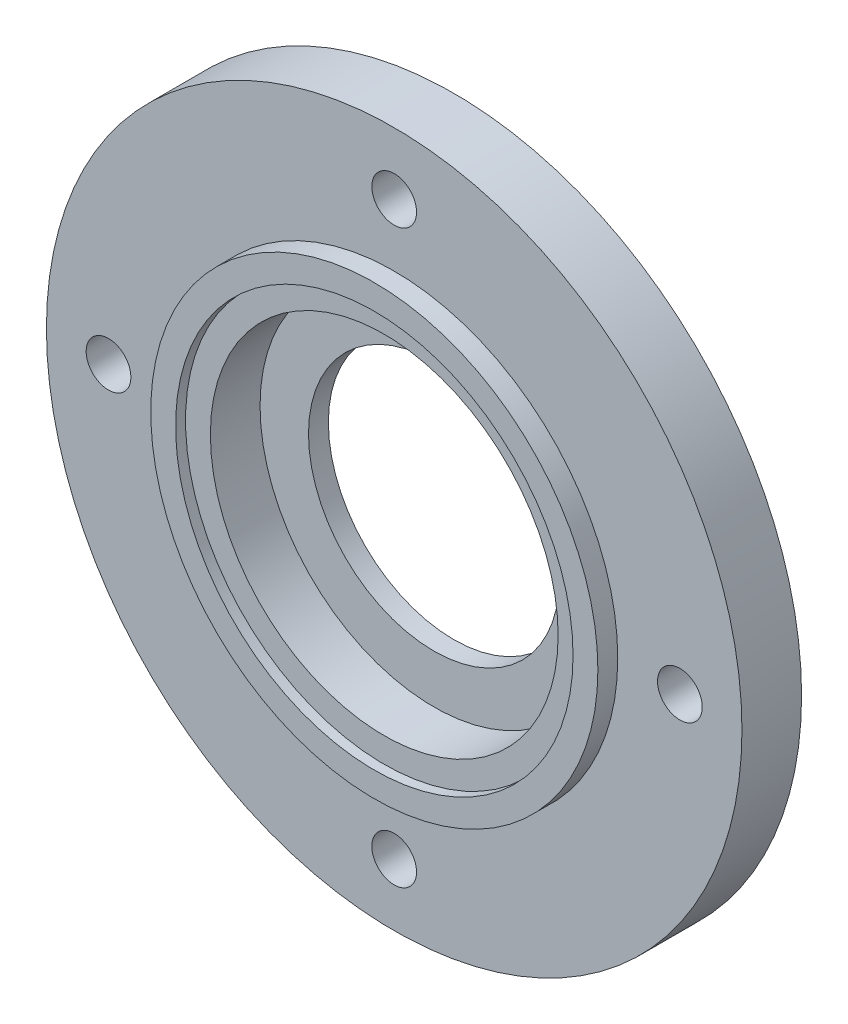
ISO-10303-21;
HEADER;
FILE_DESCRIPTION(('STEP AP214'),'2;1');
FILE_NAME('part.step','',(''),(''),'','','');
FILE_SCHEMA(('AUTOMOTIVE_DESIGN { 1 0 10303 214 1 1 1 1 }'));
ENDSEC;
DATA;
#1=APPLICATION_CONTEXT('core data for automotive mechanical design processes');
#2=APPLICATION_PROTOCOL_DEFINITION('international standard','automotive_design',2000,#1);
#3=PRODUCT_CONTEXT('',#1,'mechanical');
#4=PRODUCT('Part','Part','',(#3));
#5=PRODUCT_RELATED_PRODUCT_CATEGORY('part','',(#4));
#6=PRODUCT_DEFINITION_FORMATION('','',#4);
#7=PRODUCT_DEFINITION_CONTEXT('part definition',#1,'design');
#8=PRODUCT_DEFINITION('design','',#6,#7);
#9=PRODUCT_DEFINITION_SHAPE('','',#8);
#10=(LENGTH_UNIT() NAMED_UNIT(*) SI_UNIT(.MILLI.,.METRE.));
#11=(NAMED_UNIT(*) PLANE_ANGLE_UNIT() SI_UNIT($,.RADIAN.));
#12=(NAMED_UNIT(*) SI_UNIT($,.STERADIAN.) SOLID_ANGLE_UNIT());
#13=UNCERTAINTY_MEASURE_WITH_UNIT(LENGTH_MEASURE(1.E-05),#10,'distance_accuracy_value','');
#14=(GEOMETRIC_REPRESENTATION_CONTEXT(3) GLOBAL_UNCERTAINTY_ASSIGNED_CONTEXT((#13)) GLOBAL_UNIT_ASSIGNED_CONTEXT((#10,
#11,#12)) REPRESENTATION_CONTEXT('',''));
#15=CARTESIAN_POINT('',(0.,0.,0.));
#16=DIRECTION('',(0.,0.,1.));
#17=DIRECTION('',(1.,0.,0.));
#18=AXIS2_PLACEMENT_3D('',#15,#16,#17);
#19=CARTESIAN_POINT('',(0.,0.,-10.));
#20=DIRECTION('',(0.,0.,1.));
#21=DIRECTION('',(1.,0.,0.));
#22=AXIS2_PLACEMENT_3D('',#19,#20,#21);
#23=CYLINDRICAL_SURFACE('',#22,25.25);
#24=CARTESIAN_POINT('',(0.,0.,0.));
#25=DIRECTION('',(0.,0.,1.));
#26=DIRECTION('',(1.,0.,0.));
#27=AXIS2_PLACEMENT_3D('',#24,#25,#26);
#28=CIRCLE('',#27,25.25);
#29=CARTESIAN_POINT('',(25.25,0.,0.));
#30=VERTEX_POINT('',#29);
#31=EDGE_CURVE('E61',#30,#30,#28,.T.);
#32=ORIENTED_EDGE('',*,*,#31,.F.);
#33=EDGE_LOOP('',(#32));
#34=FACE_BOUND('',#33,.T.);
#35=CARTESIAN_POINT('',(0.,0.,4.));
#36=DIRECTION('',(0.,0.,1.));
#37=DIRECTION('',(1.,0.,0.));
#38=AXIS2_PLACEMENT_3D('',#35,#36,#37);
#39=CIRCLE('',#38,25.25);
#40=CARTESIAN_POINT('',(25.25,0.,4.));
#41=VERTEX_POINT('',#40);
#42=EDGE_CURVE('E41',#41,#41,#39,.F.);
#43=ORIENTED_EDGE('',*,*,#42,.F.);
#44=EDGE_LOOP('',(#43));
#45=FACE_BOUND('',#44,.T.);
#46=ADVANCED_FACE('F37',(#34,#45),#23,.F.);
#47=CARTESIAN_POINT('',(0.,0.,16.));
#48=DIRECTION('',(0.,0.,-1.));
#49=DIRECTION('',(-1.,0.,0.));
#50=AXIS2_PLACEMENT_3D('',#47,#48,#49);
#51=CYLINDRICAL_SURFACE('',#50,70.);
#52=CARTESIAN_POINT('',(0.,0.,0.));
#53=DIRECTION('',(0.,0.,1.));
#54=DIRECTION('',(1.,0.,0.));
#55=AXIS2_PLACEMENT_3D('',#52,#53,#54);
#56=CIRCLE('',#55,70.);
#57=CARTESIAN_POINT('',(70.,0.,0.));
#58=VERTEX_POINT('',#57);
#59=EDGE_CURVE('E10',#58,#58,#56,.T.);
#60=ORIENTED_EDGE('',*,*,#59,.T.);
#61=EDGE_LOOP('',(#60));
#62=FACE_BOUND('',#61,.T.);
#63=CARTESIAN_POINT('',(0.,0.,12.));
#64=DIRECTION('',(0.,0.,1.));
#65=DIRECTION('',(1.,0.,0.));
#66=AXIS2_PLACEMENT_3D('',#63,#64,#65);
#67=CIRCLE('',#66,70.);
#68=CARTESIAN_POINT('',(70.,0.,12.));
#69=VERTEX_POINT('',#68);
#70=EDGE_CURVE('E60',#69,#69,#67,.T.);
#71=ORIENTED_EDGE('',*,*,#70,.F.);
#72=EDGE_LOOP('',(#71));
#73=FACE_BOUND('',#72,.T.);
#74=ADVANCED_FACE('F39',(#62,#73),#51,.T.);
#75=CARTESIAN_POINT('',(0.,57.5,16.));
#76=DIRECTION('',(0.,0.,-1.));
#77=DIRECTION('',(-1.,0.,0.));
#78=AXIS2_PLACEMENT_3D('',#75,#76,#77);
#79=CYLINDRICAL_SURFACE('',#78,4.5);
#80=CARTESIAN_POINT('',(0.,57.5,0.));
#81=DIRECTION('',(0.,0.,1.));
#82=DIRECTION('',(1.,0.,0.));
#83=AXIS2_PLACEMENT_3D('',#80,#81,#82);
#84=CIRCLE('',#83,4.5);
#85=CARTESIAN_POINT('',(4.5,57.5,0.));
#86=VERTEX_POINT('',#85);
#87=EDGE_CURVE('E46',#86,#86,#84,.T.);
#88=ORIENTED_EDGE('',*,*,#87,.F.);
#89=EDGE_LOOP('',(#88));
#90=FACE_BOUND('',#89,.T.);
#91=CARTESIAN_POINT('',(0.,57.5,12.));
#92=DIRECTION('',(0.,0.,1.));
#93=DIRECTION('',(1.,0.,0.));
#94=AXIS2_PLACEMENT_3D('',#91,#92,#93);
#95=CIRCLE('',#94,4.5);
#96=CARTESIAN_POINT('',(4.5,57.5,12.));
#97=VERTEX_POINT('',#96);
#98=EDGE_CURVE('E107',#97,#97,#95,.T.);
#99=ORIENTED_EDGE('',*,*,#98,.T.);
#100=EDGE_LOOP('',(#99));
#101=FACE_BOUND('',#100,.T.);
#102=ADVANCED_FACE('F129',(#90,#101),#79,.F.);
#103=CARTESIAN_POINT('',(57.5000000000016,1.62368571360558E-12,16.));
#104=DIRECTION('',(0.,0.,-1.));
#105=DIRECTION('',(-1.,0.,0.));
#106=AXIS2_PLACEMENT_3D('',#103,#104,#105);
#107=CYLINDRICAL_SURFACE('',#106,4.50000000000127);
#108=CARTESIAN_POINT('',(57.5000000000016,1.62368571360558E-12,0.));
#109=DIRECTION('',(0.,0.,1.));
#110=DIRECTION('',(1.,0.,0.));
#111=AXIS2_PLACEMENT_3D('',#108,#109,#110);
#112=CIRCLE('',#111,4.50000000000127);
#113=CARTESIAN_POINT('',(62.0000000000029,1.62368571360558E-12,0.));
#114=VERTEX_POINT('',#113);
#115=EDGE_CURVE('E52',#114,#114,#112,.T.);
#116=ORIENTED_EDGE('',*,*,#115,.F.);
#117=EDGE_LOOP('',(#116));
#118=FACE_BOUND('',#117,.T.);
#119=CARTESIAN_POINT('',(57.5000000000016,1.62368571360558E-12,12.));
#120=DIRECTION('',(0.,0.,1.));
#121=DIRECTION('',(1.,0.,0.));
#122=AXIS2_PLACEMENT_3D('',#119,#120,#121);
#123=CIRCLE('',#122,4.50000000000127);
#124=CARTESIAN_POINT('',(62.0000000000029,1.62368571360558E-12,12.));
#125=VERTEX_POINT('',#124);
#126=EDGE_CURVE('E103',#125,#125,#123,.T.);
#127=ORIENTED_EDGE('',*,*,#126,.T.);
#128=EDGE_LOOP('',(#127));
#129=FACE_BOUND('',#128,.T.);
#130=ADVANCED_FACE('F125',(#118,#129),#107,.F.);
#131=CARTESIAN_POINT('',(3.24737142721117E-12,-57.5,16.));
#132=DIRECTION('',(0.,0.,-1.));
#133=DIRECTION('',(-1.,0.,0.));
#134=AXIS2_PLACEMENT_3D('',#131,#132,#133);
#135=CYLINDRICAL_SURFACE('',#134,4.50000000000349);
#136=CARTESIAN_POINT('',(3.24737142721117E-12,-57.5,0.));
#137=DIRECTION('',(0.,0.,1.));
#138=DIRECTION('',(1.,0.,0.));
#139=AXIS2_PLACEMENT_3D('',#136,#137,#138);
#140=CIRCLE('',#139,4.50000000000349);
#141=CARTESIAN_POINT('',(4.50000000000674,-57.5,0.));
#142=VERTEX_POINT('',#141);
#143=EDGE_CURVE('E115',#142,#142,#140,.T.);
#144=ORIENTED_EDGE('',*,*,#143,.F.);
#145=EDGE_LOOP('',(#144));
#146=FACE_BOUND('',#145,.T.);
#147=CARTESIAN_POINT('',(3.24737142721117E-12,-57.5,12.));
#148=DIRECTION('',(0.,0.,1.));
#149=DIRECTION('',(1.,0.,0.));
#150=AXIS2_PLACEMENT_3D('',#147,#148,#149);
#151=CIRCLE('',#150,4.50000000000349);
#152=CARTESIAN_POINT('',(4.50000000000674,-57.5,12.));
#153=VERTEX_POINT('',#152);
#154=EDGE_CURVE('E59',#153,#153,#151,.T.);
#155=ORIENTED_EDGE('',*,*,#154,.T.);
#156=EDGE_LOOP('',(#155));
#157=FACE_BOUND('',#156,.T.);
#158=ADVANCED_FACE('F128',(#146,#157),#135,.F.);
#159=CARTESIAN_POINT('',(-57.4999999999984,-1.63072743270068E-12,16.));
#160=DIRECTION('',(0.,0.,-1.));
#161=DIRECTION('',(-1.,0.,0.));
#162=AXIS2_PLACEMENT_3D('',#159,#160,#161);
#163=CYLINDRICAL_SURFACE('',#162,4.50000000000261);
#164=CARTESIAN_POINT('',(-57.4999999999984,-1.63072743270068E-12,0.));
#165=DIRECTION('',(0.,0.,1.));
#166=DIRECTION('',(1.,0.,0.));
#167=AXIS2_PLACEMENT_3D('',#164,#165,#166);
#168=CIRCLE('',#167,4.50000000000261);
#169=CARTESIAN_POINT('',(-52.9999999999958,-1.63072743270068E-12,0.));
#170=VERTEX_POINT('',#169);
#171=EDGE_CURVE('E111',#170,#170,#168,.T.);
#172=ORIENTED_EDGE('',*,*,#171,.F.);
#173=EDGE_LOOP('',(#172));
#174=FACE_BOUND('',#173,.T.);
#175=CARTESIAN_POINT('',(-57.4999999999984,-1.63072743270068E-12,12.));
#176=DIRECTION('',(0.,0.,1.));
#177=DIRECTION('',(1.,0.,0.));
#178=AXIS2_PLACEMENT_3D('',#175,#176,#177);
#179=CIRCLE('',#178,4.50000000000261);
#180=CARTESIAN_POINT('',(-52.9999999999958,-1.63072743270068E-12,12.));
#181=VERTEX_POINT('',#180);
#182=EDGE_CURVE('E56',#181,#181,#179,.T.);
#183=ORIENTED_EDGE('',*,*,#182,.T.);
#184=EDGE_LOOP('',(#183));
#185=FACE_BOUND('',#184,.T.);
#186=ADVANCED_FACE('F176',(#174,#185),#163,.F.);
#187=CARTESIAN_POINT('',(0.,0.,0.));
#188=DIRECTION('',(0.,0.,1.));
#189=DIRECTION('',(1.,0.,0.));
#190=AXIS2_PLACEMENT_3D('',#187,#188,#189);
#191=PLANE('',#190);
#192=ORIENTED_EDGE('',*,*,#31,.T.);
#193=EDGE_LOOP('',(#192));
#194=FACE_BOUND('',#193,.T.);
#195=ORIENTED_EDGE('',*,*,#59,.F.);
#196=EDGE_LOOP('',(#195));
#197=FACE_BOUND('',#196,.T.);
#198=ORIENTED_EDGE('',*,*,#87,.T.);
#199=EDGE_LOOP('',(#198));
#200=FACE_BOUND('',#199,.T.);
#201=ORIENTED_EDGE('',*,*,#115,.T.);
#202=EDGE_LOOP('',(#201));
#203=FACE_BOUND('',#202,.T.);
#204=ORIENTED_EDGE('',*,*,#143,.T.);
#205=EDGE_LOOP('',(#204));
#206=FACE_BOUND('',#205,.T.);
#207=ORIENTED_EDGE('',*,*,#171,.T.);
#208=EDGE_LOOP('',(#207));
#209=FACE_BOUND('',#208,.T.);
#210=ADVANCED_FACE('F122',(#194,#197,#200,#203,#206,#209),#191,.F.);
#211=CARTESIAN_POINT('',(0.,0.,12.));
#212=DIRECTION('',(0.,0.,1.));
#213=DIRECTION('',(1.,0.,0.));
#214=AXIS2_PLACEMENT_3D('',#211,#212,#213);
#215=PLANE('',#214);
#216=ORIENTED_EDGE('',*,*,#98,.F.);
#217=EDGE_LOOP('',(#216));
#218=FACE_BOUND('',#217,.T.);
#219=ORIENTED_EDGE('',*,*,#126,.F.);
#220=EDGE_LOOP('',(#219));
#221=FACE_BOUND('',#220,.T.);
#222=ORIENTED_EDGE('',*,*,#154,.F.);
#223=EDGE_LOOP('',(#222));
#224=FACE_BOUND('',#223,.T.);
#225=ORIENTED_EDGE('',*,*,#182,.F.);
#226=EDGE_LOOP('',(#225));
#227=FACE_BOUND('',#226,.T.);
#228=CARTESIAN_POINT('',(0.,0.,12.));
#229=DIRECTION('',(0.,0.,1.));
#230=DIRECTION('',(1.,0.,0.));
#231=AXIS2_PLACEMENT_3D('',#228,#229,#230);
#232=CIRCLE('',#231,45.);
#233=CARTESIAN_POINT('',(45.,0.,12.));
#234=VERTEX_POINT('',#233);
#235=EDGE_CURVE('E90',#234,#234,#232,.T.);
#236=ORIENTED_EDGE('',*,*,#235,.F.);
#237=EDGE_LOOP('',(#236));
#238=FACE_BOUND('',#237,.T.);
#239=ORIENTED_EDGE('',*,*,#70,.T.);
#240=EDGE_LOOP('',(#239));
#241=FACE_BOUND('',#240,.T.);
#242=ADVANCED_FACE('F133',(#218,#221,#224,#227,#238,#241),#215,.T.);
#243=CARTESIAN_POINT('',(0.,0.,12.));
#244=DIRECTION('',(0.,0.,1.));
#245=DIRECTION('',(1.,0.,0.));
#246=AXIS2_PLACEMENT_3D('',#243,#244,#245);
#247=CYLINDRICAL_SURFACE('',#246,45.);
#248=ORIENTED_EDGE('',*,*,#235,.T.);
#249=EDGE_LOOP('',(#248));
#250=FACE_BOUND('',#249,.T.);
#251=CARTESIAN_POINT('',(0.,0.,16.));
#252=DIRECTION('',(0.,0.,1.));
#253=DIRECTION('',(1.,0.,0.));
#254=AXIS2_PLACEMENT_3D('',#251,#252,#253);
#255=CIRCLE('',#254,45.);
#256=CARTESIAN_POINT('',(45.,0.,16.));
#257=VERTEX_POINT('',#256);
#258=EDGE_CURVE('E88',#257,#257,#255,.T.);
#259=ORIENTED_EDGE('',*,*,#258,.F.);
#260=EDGE_LOOP('',(#259));
#261=FACE_BOUND('',#260,.T.);
#262=ADVANCED_FACE('F136',(#250,#261),#247,.T.);
#263=CARTESIAN_POINT('',(0.,0.,16.));
#264=DIRECTION('',(0.,0.,1.));
#265=DIRECTION('',(1.,0.,0.));
#266=AXIS2_PLACEMENT_3D('',#263,#264,#265);
#267=PLANE('',#266);
#268=CARTESIAN_POINT('',(0.,0.,16.));
#269=DIRECTION('',(0.,0.,1.));
#270=DIRECTION('',(1.,0.,0.));
#271=AXIS2_PLACEMENT_3D('',#268,#269,#270);
#272=CIRCLE('',#271,40.);
#273=CARTESIAN_POINT('',(40.,0.,16.));
#274=VERTEX_POINT('',#273);
#275=EDGE_CURVE('E64',#274,#274,#272,.T.);
#276=ORIENTED_EDGE('',*,*,#275,.F.);
#277=EDGE_LOOP('',(#276));
#278=FACE_BOUND('',#277,.T.);
#279=ORIENTED_EDGE('',*,*,#258,.T.);
#280=EDGE_LOOP('',(#279));
#281=FACE_BOUND('',#280,.T.);
#282=ADVANCED_FACE('F171',(#278,#281),#267,.T.);
#283=CARTESIAN_POINT('',(0.,0.,14.));
#284=DIRECTION('',(0.,0.,1.));
#285=DIRECTION('',(1.,0.,0.));
#286=AXIS2_PLACEMENT_3D('',#283,#284,#285);
#287=CYLINDRICAL_SURFACE('',#286,40.);
#288=CARTESIAN_POINT('',(0.,0.,14.));
#289=DIRECTION('',(0.,0.,1.));
#290=DIRECTION('',(1.,0.,0.));
#291=AXIS2_PLACEMENT_3D('',#288,#289,#290);
#292=CIRCLE('',#291,40.);
#293=CARTESIAN_POINT('',(40.,0.,14.));
#294=VERTEX_POINT('',#293);
#295=EDGE_CURVE('E70',#294,#294,#292,.T.);
#296=ORIENTED_EDGE('',*,*,#295,.F.);
#297=EDGE_LOOP('',(#296));
#298=FACE_BOUND('',#297,.T.);
#299=ORIENTED_EDGE('',*,*,#275,.T.);
#300=EDGE_LOOP('',(#299));
#301=FACE_BOUND('',#300,.T.);
#302=ADVANCED_FACE('F167',(#298,#301),#287,.F.);
#303=CARTESIAN_POINT('',(0.,0.,14.));
#304=DIRECTION('',(0.,0.,1.));
#305=DIRECTION('',(1.,0.,0.));
#306=AXIS2_PLACEMENT_3D('',#303,#304,#305);
#307=PLANE('',#306);
#308=CARTESIAN_POINT('',(0.,0.,14.));
#309=DIRECTION('',(0.,0.,1.));
#310=DIRECTION('',(1.,0.,0.));
#311=AXIS2_PLACEMENT_3D('',#308,#309,#310);
#312=CIRCLE('',#311,35.);
#313=CARTESIAN_POINT('',(35.,0.,14.));
#314=VERTEX_POINT('',#313);
#315=EDGE_CURVE('E78',#314,#314,#312,.T.);
#316=ORIENTED_EDGE('',*,*,#315,.F.);
#317=EDGE_LOOP('',(#316));
#318=FACE_BOUND('',#317,.T.);
#319=ORIENTED_EDGE('',*,*,#295,.T.);
#320=EDGE_LOOP('',(#319));
#321=FACE_BOUND('',#320,.T.);
#322=ADVANCED_FACE('F163',(#318,#321),#307,.T.);
#323=CARTESIAN_POINT('',(0.,0.,4.));
#324=DIRECTION('',(0.,0.,1.));
#325=DIRECTION('',(1.,0.,0.));
#326=AXIS2_PLACEMENT_3D('',#323,#324,#325);
#327=PLANE('',#326);
#328=CARTESIAN_POINT('',(0.,0.,4.));
#329=DIRECTION('',(0.,0.,1.));
#330=DIRECTION('',(1.,0.,0.));
#331=AXIS2_PLACEMENT_3D('',#328,#329,#330);
#332=CIRCLE('',#331,35.);
#333=CARTESIAN_POINT('',(35.,0.,4.));
#334=VERTEX_POINT('',#333);
#335=EDGE_CURVE('E73',#334,#334,#332,.T.);
#336=ORIENTED_EDGE('',*,*,#335,.T.);
#337=EDGE_LOOP('',(#336));
#338=FACE_BOUND('',#337,.T.);
#339=ORIENTED_EDGE('',*,*,#42,.T.);
#340=EDGE_LOOP('',(#339));
#341=FACE_BOUND('',#340,.T.);
#342=ADVANCED_FACE('F166',(#338,#341),#327,.T.);
#343=CARTESIAN_POINT('',(0.,0.,4.));
#344=DIRECTION('',(0.,0.,1.));
#345=DIRECTION('',(1.,0.,0.));
#346=AXIS2_PLACEMENT_3D('',#343,#344,#345);
#347=CYLINDRICAL_SURFACE('',#346,35.);
#348=ORIENTED_EDGE('',*,*,#335,.F.);
#349=EDGE_LOOP('',(#348));
#350=FACE_BOUND('',#349,.T.);
#351=ORIENTED_EDGE('',*,*,#315,.T.);
#352=EDGE_LOOP('',(#351));
#353=FACE_BOUND('',#352,.T.);
#354=ADVANCED_FACE('F161',(#350,#353),#347,.F.);
#355=CLOSED_SHELL('',(#46,#74,#102,#130,#158,#186,#210,#242,#262,#282,#302,#322,#342,#354));
#356=MANIFOLD_SOLID_BREP('B2',#355);
#357=ADVANCED_BREP_SHAPE_REPRESENTATION('',(#18,#356),#14);
#358=SHAPE_DEFINITION_REPRESENTATION(#9,#357);
ENDSEC;
END-ISO-10303-21;
